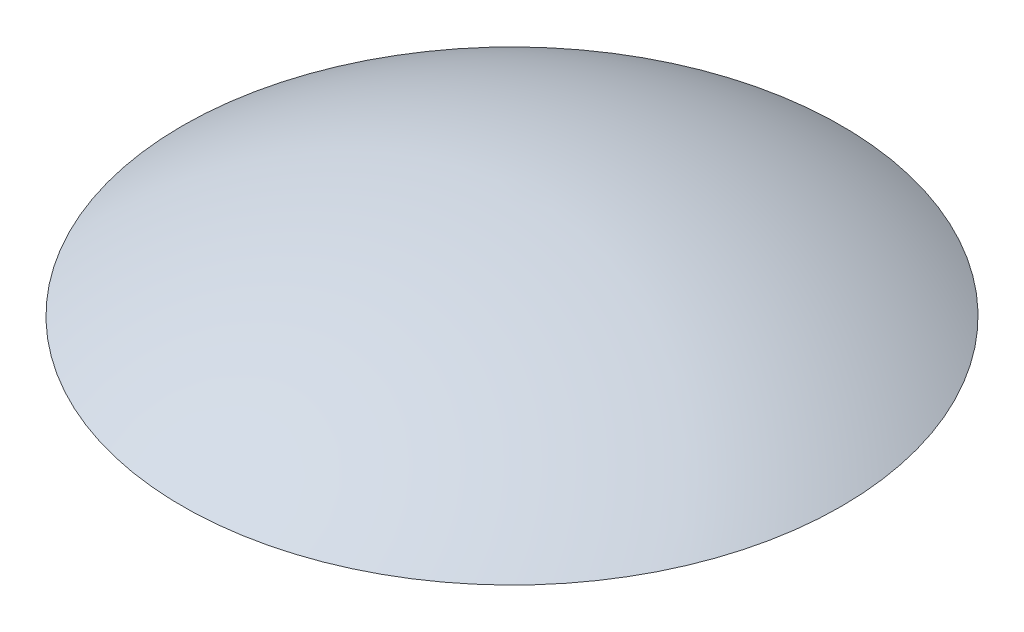
ISO-10303-21;
HEADER;
FILE_DESCRIPTION(('STEP AP214'),'2;1');
FILE_NAME('part.step','',(''),(''),'','','');
FILE_SCHEMA(('AUTOMOTIVE_DESIGN { 1 0 10303 214 1 1 1 1 }'));
ENDSEC;
DATA;
#1=APPLICATION_CONTEXT('core data for automotive mechanical design processes');
#2=APPLICATION_PROTOCOL_DEFINITION('international standard','automotive_design',2000,#1);
#3=PRODUCT_CONTEXT('',#1,'mechanical');
#4=PRODUCT('Part','Part','',(#3));
#5=PRODUCT_RELATED_PRODUCT_CATEGORY('part','',(#4));
#6=PRODUCT_DEFINITION_FORMATION('','',#4);
#7=PRODUCT_DEFINITION_CONTEXT('part definition',#1,'design');
#8=PRODUCT_DEFINITION('design','',#6,#7);
#9=PRODUCT_DEFINITION_SHAPE('','',#8);
#10=(LENGTH_UNIT() NAMED_UNIT(*) SI_UNIT(.MILLI.,.METRE.));
#11=(NAMED_UNIT(*) PLANE_ANGLE_UNIT() SI_UNIT($,.RADIAN.));
#12=(NAMED_UNIT(*) SI_UNIT($,.STERADIAN.) SOLID_ANGLE_UNIT());
#13=UNCERTAINTY_MEASURE_WITH_UNIT(LENGTH_MEASURE(1.E-05),#10,'distance_accuracy_value','');
#14=(GEOMETRIC_REPRESENTATION_CONTEXT(3) GLOBAL_UNCERTAINTY_ASSIGNED_CONTEXT((#13)) GLOBAL_UNIT_ASSIGNED_CONTEXT((#10,
#11,#12)) REPRESENTATION_CONTEXT('',''));
#15=CARTESIAN_POINT('',(0.,0.,0.));
#16=DIRECTION('',(0.,0.,1.));
#17=DIRECTION('',(1.,0.,0.));
#18=AXIS2_PLACEMENT_3D('',#15,#16,#17);
#19=CARTESIAN_POINT('',(-101.401417421973,28.4706523324736,0.));
#20=DIRECTION('',(1.85028303094194E-13,-1.,0.));
#21=DIRECTION('',(1.,1.85028303094194E-13,0.));
#22=AXIS2_PLACEMENT_3D('',#19,#20,#21);
#23=SPHERICAL_SURFACE('',#22,0.454148495661082);
#24=CARTESIAN_POINT('',(-101.401417421973,28.8497972336806,0.));
#25=DIRECTION('',(1.85028303094194E-13,-1.,0.));
#26=DIRECTION('',(1.,1.85028303094194E-13,0.));
#27=AXIS2_PLACEMENT_3D('',#24,#25,#26);
#28=CIRCLE('',#27,0.25);
#29=CARTESIAN_POINT('',(-101.151417421973,28.8497972336806,0.));
#30=VERTEX_POINT('',#29);
#31=EDGE_CURVE('E10',#30,#30,#28,.T.);
#32=ORIENTED_EDGE('',*,*,#31,.F.);
#33=EDGE_LOOP('',(#32));
#34=FACE_BOUND('',#33,.T.);
#35=ADVANCED_FACE('F34',(#34),#23,.T.);
#36=CARTESIAN_POINT('',(-101.651417421973,28.8497972336805,0.));
#37=DIRECTION('',(-1.85028303094194E-13,1.,0.));
#38=DIRECTION('',(-1.,-1.85028303094194E-13,0.));
#39=AXIS2_PLACEMENT_3D('',#36,#37,#38);
#40=PLANE('',#39);
#41=ORIENTED_EDGE('',*,*,#31,.T.);
#42=EDGE_LOOP('',(#41));
#43=FACE_BOUND('',#42,.T.);
#44=ADVANCED_FACE('F41',(#43),#40,.F.);
#45=CLOSED_SHELL('',(#35,#44));
#46=MANIFOLD_SOLID_BREP('B2',#45);
#47=ADVANCED_BREP_SHAPE_REPRESENTATION('',(#18,#46),#14);
#48=SHAPE_DEFINITION_REPRESENTATION(#9,#47);
ENDSEC;
END-ISO-10303-21;
